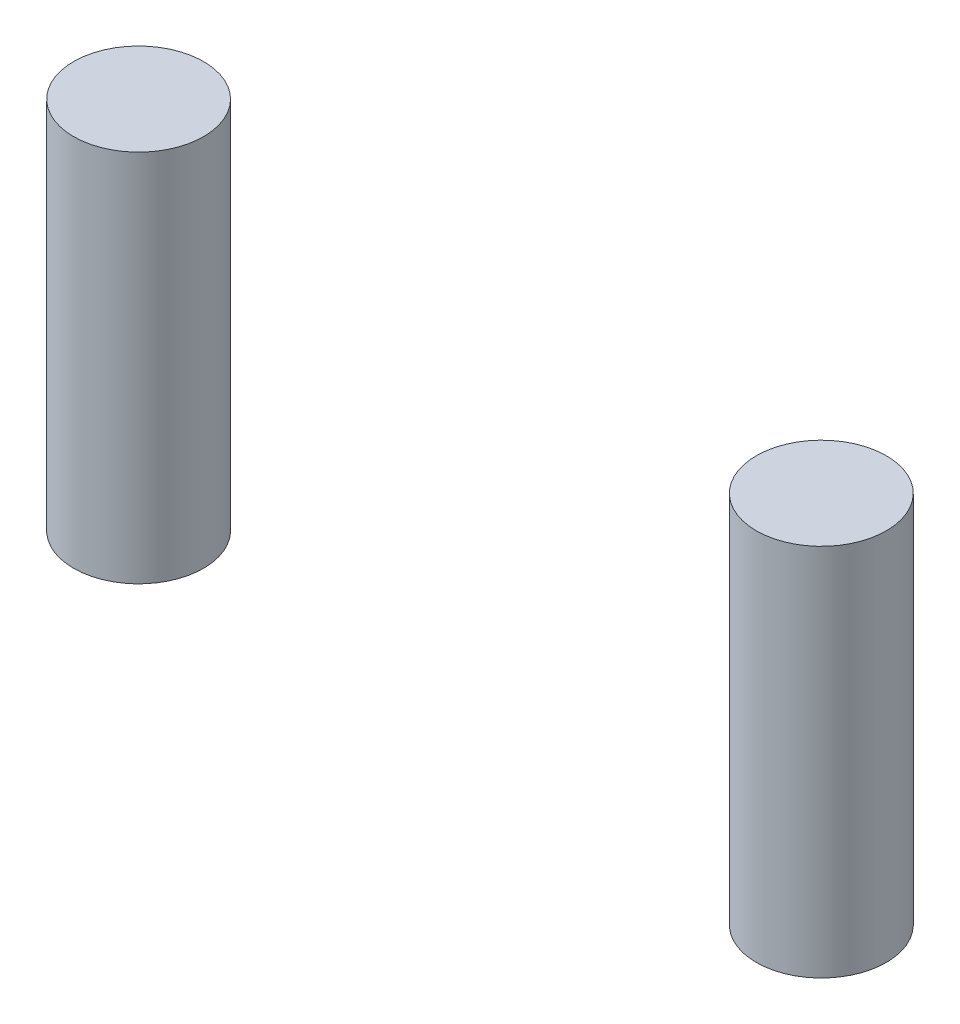
ISO-10303-21;
HEADER;
FILE_DESCRIPTION(('STEP AP214'),'2;1');
FILE_NAME('part.step','',(''),(''),'','','');
FILE_SCHEMA(('AUTOMOTIVE_DESIGN { 1 0 10303 214 1 1 1 1 }'));
ENDSEC;
DATA;
#1=APPLICATION_CONTEXT('core data for automotive mechanical design processes');
#2=APPLICATION_PROTOCOL_DEFINITION('international standard','automotive_design',2000,#1);
#3=PRODUCT_CONTEXT('',#1,'mechanical');
#4=PRODUCT('Part','Part','',(#3));
#5=PRODUCT_RELATED_PRODUCT_CATEGORY('part','',(#4));
#6=PRODUCT_DEFINITION_FORMATION('','',#4);
#7=PRODUCT_DEFINITION_CONTEXT('part definition',#1,'design');
#8=PRODUCT_DEFINITION('design','',#6,#7);
#9=PRODUCT_DEFINITION_SHAPE('','',#8);
#10=(LENGTH_UNIT() NAMED_UNIT(*) SI_UNIT(.MILLI.,.METRE.));
#11=(NAMED_UNIT(*) PLANE_ANGLE_UNIT() SI_UNIT($,.RADIAN.));
#12=(NAMED_UNIT(*) SI_UNIT($,.STERADIAN.) SOLID_ANGLE_UNIT());
#13=UNCERTAINTY_MEASURE_WITH_UNIT(LENGTH_MEASURE(1.E-05),#10,'distance_accuracy_value','');
#14=(GEOMETRIC_REPRESENTATION_CONTEXT(3) GLOBAL_UNCERTAINTY_ASSIGNED_CONTEXT((#13)) GLOBAL_UNIT_ASSIGNED_CONTEXT((#10,
#11,#12)) REPRESENTATION_CONTEXT('',''));
#15=CARTESIAN_POINT('',(0.,0.,0.));
#16=DIRECTION('',(0.,0.,1.));
#17=DIRECTION('',(1.,0.,0.));
#18=AXIS2_PLACEMENT_3D('',#15,#16,#17);
#19=CARTESIAN_POINT('',(10.5,-96.5,26.));
#20=DIRECTION('',(0.,-1.,0.));
#21=DIRECTION('',(0.,0.,-1.));
#22=AXIS2_PLACEMENT_3D('',#19,#20,#21);
#23=CYLINDRICAL_SURFACE('',#22,2.);
#24=CARTESIAN_POINT('',(10.5,-96.5,26.));
#25=DIRECTION('',(0.,1.,0.));
#26=DIRECTION('',(0.,0.,1.));
#27=AXIS2_PLACEMENT_3D('',#24,#25,#26);
#28=CIRCLE('',#27,2.);
#29=CARTESIAN_POINT('',(10.5,-96.5,28.));
#30=VERTEX_POINT('',#29);
#31=EDGE_CURVE('E11',#30,#30,#28,.T.);
#32=ORIENTED_EDGE('',*,*,#31,.F.);
#33=EDGE_LOOP('',(#32));
#34=FACE_BOUND('',#33,.T.);
#35=CARTESIAN_POINT('',(10.5,-108.,26.));
#36=DIRECTION('',(0.,1.,0.));
#37=DIRECTION('',(0.,0.,1.));
#38=AXIS2_PLACEMENT_3D('',#35,#36,#37);
#39=CIRCLE('',#38,2.);
#40=CARTESIAN_POINT('',(10.5,-108.,28.));
#41=VERTEX_POINT('',#40);
#42=EDGE_CURVE('E48',#41,#41,#39,.T.);
#43=ORIENTED_EDGE('',*,*,#42,.T.);
#44=EDGE_LOOP('',(#43));
#45=FACE_BOUND('',#44,.T.);
#46=ADVANCED_FACE('F45',(#34,#45),#23,.T.);
#47=CARTESIAN_POINT('',(10.5,-96.5,26.));
#48=DIRECTION('',(0.,1.,0.));
#49=DIRECTION('',(0.,0.,1.));
#50=AXIS2_PLACEMENT_3D('',#47,#48,#49);
#51=PLANE('',#50);
#52=ORIENTED_EDGE('',*,*,#31,.T.);
#53=EDGE_LOOP('',(#52));
#54=FACE_BOUND('',#53,.T.);
#55=ADVANCED_FACE('F60',(#54),#51,.T.);
#56=CARTESIAN_POINT('',(10.5,-108.,26.));
#57=DIRECTION('',(0.,1.,0.));
#58=DIRECTION('',(0.,0.,1.));
#59=AXIS2_PLACEMENT_3D('',#56,#57,#58);
#60=PLANE('',#59);
#61=ORIENTED_EDGE('',*,*,#42,.F.);
#62=EDGE_LOOP('',(#61));
#63=FACE_BOUND('',#62,.T.);
#64=ADVANCED_FACE('F58',(#63),#60,.F.);
#65=CLOSED_SHELL('',(#46,#55,#64));
#66=MANIFOLD_SOLID_BREP('B2',#65);
#67=CARTESIAN_POINT('',(-10.5,-96.5,26.));
#68=DIRECTION('',(0.,-1.,0.));
#69=DIRECTION('',(0.,0.,-1.));
#70=AXIS2_PLACEMENT_3D('',#67,#68,#69);
#71=CYLINDRICAL_SURFACE('',#70,2.);
#72=CARTESIAN_POINT('',(-10.5,-96.5,26.));
#73=DIRECTION('',(0.,1.,0.));
#74=DIRECTION('',(0.,0.,1.));
#75=AXIS2_PLACEMENT_3D('',#72,#73,#74);
#76=CIRCLE('',#75,2.);
#77=CARTESIAN_POINT('',(-10.5,-96.5,28.));
#78=VERTEX_POINT('',#77);
#79=EDGE_CURVE('E44',#78,#78,#76,.T.);
#80=ORIENTED_EDGE('',*,*,#79,.F.);
#81=EDGE_LOOP('',(#80));
#82=FACE_BOUND('',#81,.T.);
#83=CARTESIAN_POINT('',(-10.5,-108.,26.));
#84=DIRECTION('',(0.,1.,0.));
#85=DIRECTION('',(0.,0.,1.));
#86=AXIS2_PLACEMENT_3D('',#83,#84,#85);
#87=CIRCLE('',#86,2.);
#88=CARTESIAN_POINT('',(-10.5,-108.,28.));
#89=VERTEX_POINT('',#88);
#90=EDGE_CURVE('E101',#89,#89,#87,.T.);
#91=ORIENTED_EDGE('',*,*,#90,.T.);
#92=EDGE_LOOP('',(#91));
#93=FACE_BOUND('',#92,.T.);
#94=ADVANCED_FACE('F98',(#82,#93),#71,.T.);
#95=CARTESIAN_POINT('',(-10.5,-96.5,26.));
#96=DIRECTION('',(0.,1.,0.));
#97=DIRECTION('',(0.,0.,1.));
#98=AXIS2_PLACEMENT_3D('',#95,#96,#97);
#99=PLANE('',#98);
#100=ORIENTED_EDGE('',*,*,#79,.T.);
#101=EDGE_LOOP('',(#100));
#102=FACE_BOUND('',#101,.T.);
#103=ADVANCED_FACE('F113',(#102),#99,.T.);
#104=CARTESIAN_POINT('',(-10.5,-108.,26.));
#105=DIRECTION('',(0.,1.,0.));
#106=DIRECTION('',(0.,0.,1.));
#107=AXIS2_PLACEMENT_3D('',#104,#105,#106);
#108=PLANE('',#107);
#109=ORIENTED_EDGE('',*,*,#90,.F.);
#110=EDGE_LOOP('',(#109));
#111=FACE_BOUND('',#110,.T.);
#112=ADVANCED_FACE('F111',(#111),#108,.F.);
#113=CLOSED_SHELL('',(#94,#103,#112));
#114=MANIFOLD_SOLID_BREP('B6',#113);
#115=ADVANCED_BREP_SHAPE_REPRESENTATION('',(#18,#66,#114),#14);
#116=SHAPE_DEFINITION_REPRESENTATION(#9,#115);
ENDSEC;
END-ISO-10303-21;
